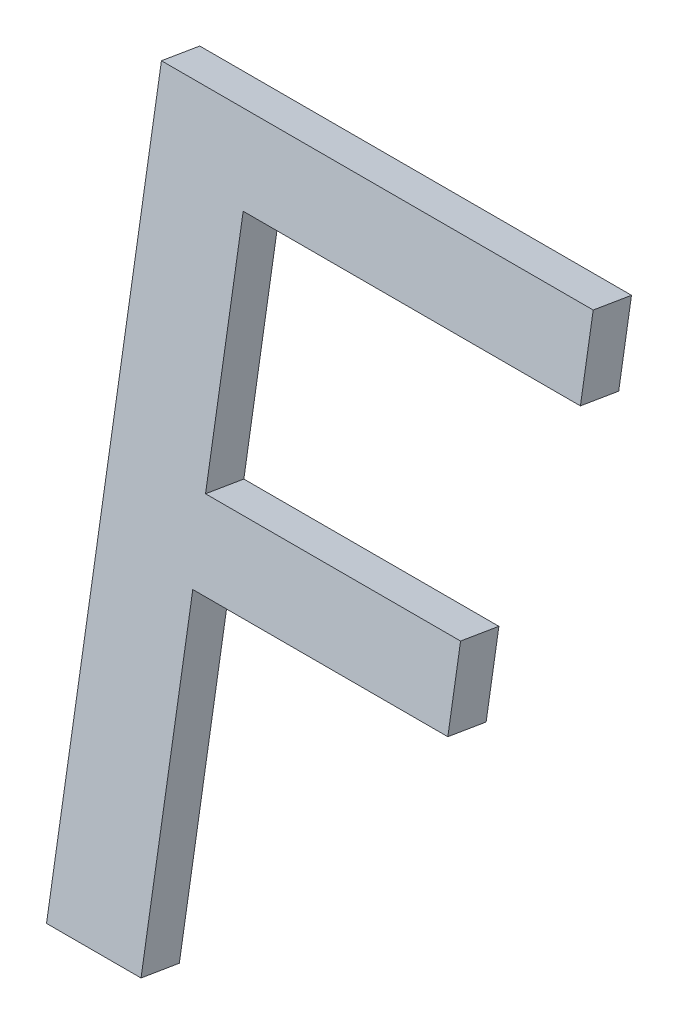
ISO-10303-21;
HEADER;
FILE_DESCRIPTION(('STEP AP214'),'2;1');
FILE_NAME('part.step','',(''),(''),'','','');
FILE_SCHEMA(('AUTOMOTIVE_DESIGN { 1 0 10303 214 1 1 1 1 }'));
ENDSEC;
DATA;
#1=APPLICATION_CONTEXT('core data for automotive mechanical design processes');
#2=APPLICATION_PROTOCOL_DEFINITION('international standard','automotive_design',2000,#1);
#3=PRODUCT_CONTEXT('',#1,'mechanical');
#4=PRODUCT('Part','Part','',(#3));
#5=PRODUCT_RELATED_PRODUCT_CATEGORY('part','',(#4));
#6=PRODUCT_DEFINITION_FORMATION('','',#4);
#7=PRODUCT_DEFINITION_CONTEXT('part definition',#1,'design');
#8=PRODUCT_DEFINITION('design','',#6,#7);
#9=PRODUCT_DEFINITION_SHAPE('','',#8);
#10=(LENGTH_UNIT() NAMED_UNIT(*) SI_UNIT(.MILLI.,.METRE.));
#11=(NAMED_UNIT(*) PLANE_ANGLE_UNIT() SI_UNIT($,.RADIAN.));
#12=(NAMED_UNIT(*) SI_UNIT($,.STERADIAN.) SOLID_ANGLE_UNIT());
#13=UNCERTAINTY_MEASURE_WITH_UNIT(LENGTH_MEASURE(1.E-05),#10,'distance_accuracy_value','');
#14=(GEOMETRIC_REPRESENTATION_CONTEXT(3) GLOBAL_UNCERTAINTY_ASSIGNED_CONTEXT((#13)) GLOBAL_UNIT_ASSIGNED_CONTEXT((#10,
#11,#12)) REPRESENTATION_CONTEXT('',''));
#15=CARTESIAN_POINT('',(0.,0.,0.));
#16=DIRECTION('',(0.,0.,1.));
#17=DIRECTION('',(1.,0.,0.));
#18=AXIS2_PLACEMENT_3D('',#15,#16,#17);
#19=CARTESIAN_POINT('',(1176.66781954887,1267.35947410269,1223.14813558136));
#20=DIRECTION('',(1.,0.,0.));
#21=DIRECTION('',(0.,0.,-1.));
#22=AXIS2_PLACEMENT_3D('',#19,#20,#21);
#23=PLANE('',#22);
#24=CARTESIAN_POINT('',(1176.66781954887,1266.53747916617,1218.2161659622));
#25=CARTESIAN_POINT('',(1176.66781954887,1256.84439088155,1219.83168067631));
#26=CARTESIAN_POINT('',(1176.66781954887,1247.15130259693,1221.44719539041));
#27=CARTESIAN_POINT('',(1176.66781954887,1237.4582143123,1223.06271010451));
#28=B_SPLINE_CURVE_WITH_KNOTS('',3,(#24,#25,#26,#27),.UNSPECIFIED.,.F.,.F.,(4,4),(0.,
0.0826196397014323),.UNSPECIFIED.);
#29=CARTESIAN_POINT('',(1176.66781954887,1266.53747916617,1218.2161659622));
#30=VERTEX_POINT('',#29);
#31=CARTESIAN_POINT('',(1176.66781954887,1237.4582143123,1223.06271010451));
#32=VERTEX_POINT('',#31);
#33=EDGE_CURVE('E105',#30,#32,#28,.T.);
#34=ORIENTED_EDGE('',*,*,#33,.F.);
#35=DIRECTION('',(0.,-0.164398987305355,-0.986393923832144));
#36=VECTOR('',#35,1.);
#37=CARTESIAN_POINT('',(1176.66781954887,1267.35947410269,1223.14813558136));
#38=LINE('',#37,#36);
#39=CARTESIAN_POINT('',(1176.66781954887,1267.35947410269,1223.14813558136));
#40=VERTEX_POINT('',#39);
#41=EDGE_CURVE('E96',#40,#30,#38,.T.);
#42=ORIENTED_EDGE('',*,*,#41,.F.);
#43=CARTESIAN_POINT('',(1176.66781954887,1267.35947410269,1223.14813558136));
#44=CARTESIAN_POINT('',(1176.66781954887,1257.66638581807,1224.76365029547));
#45=CARTESIAN_POINT('',(1176.66781954887,1247.97329753345,1226.37916500957));
#46=CARTESIAN_POINT('',(1176.66781954887,1238.28020924883,1227.99467972367));
#47=B_SPLINE_CURVE_WITH_KNOTS('',3,(#43,#44,#45,#46),.UNSPECIFIED.,.F.,.F.,(4,4),(0.,
0.0826196397014323),.UNSPECIFIED.);
#48=CARTESIAN_POINT('',(1176.66781954887,1238.28020924883,1227.99467972367));
#49=VERTEX_POINT('',#48);
#50=EDGE_CURVE('E104',#40,#49,#47,.T.);
#51=ORIENTED_EDGE('',*,*,#50,.T.);
#52=DIRECTION('',(0.,-0.164398987305355,-0.986393923832144));
#53=VECTOR('',#52,1.);
#54=CARTESIAN_POINT('',(1176.66781954887,1238.28020924883,1227.99467972367));
#55=LINE('',#54,#53);
#56=EDGE_CURVE('E114',#49,#32,#55,.T.);
#57=ORIENTED_EDGE('',*,*,#56,.T.);
#58=EDGE_LOOP('',(#34,#42,#51,#57));
#59=FACE_BOUND('',#58,.T.);
#60=ADVANCED_FACE('F17',(#59),#23,.T.);
#61=CARTESIAN_POINT('',(1176.66781954887,1238.28020924883,1227.99467972367));
#62=DIRECTION('',(0.,0.986393923832144,-0.164398987305355));
#63=DIRECTION('',(0.,0.164398987305355,0.986393923832144));
#64=AXIS2_PLACEMENT_3D('',#61,#62,#63);
#65=PLANE('',#64);
#66=CARTESIAN_POINT('',(1176.66781954887,1237.4582143123,1223.06271010451));
#67=CARTESIAN_POINT('',(1187.61157894737,1237.4582143123,1223.06271010451));
#68=CARTESIAN_POINT('',(1198.55533834586,1237.4582143123,1223.06271010451));
#69=CARTESIAN_POINT('',(1209.49909774436,1237.4582143123,1223.06271010451));
#70=B_SPLINE_CURVE_WITH_KNOTS('',3,(#66,#67,#68,#69),.UNSPECIFIED.,.F.,.F.,(4,4),
(0.0826196397014323,0.174630280043704),.UNSPECIFIED.);
#71=CARTESIAN_POINT('',(1209.49909774436,1237.4582143123,1223.06271010451));
#72=VERTEX_POINT('',#71);
#73=EDGE_CURVE('E132',#32,#72,#70,.T.);
#74=ORIENTED_EDGE('',*,*,#73,.F.);
#75=ORIENTED_EDGE('',*,*,#56,.F.);
#76=CARTESIAN_POINT('',(1176.66781954887,1238.28020924883,1227.99467972367));
#77=CARTESIAN_POINT('',(1187.61157894737,1238.28020924883,1227.99467972367));
#78=CARTESIAN_POINT('',(1198.55533834586,1238.28020924883,1227.99467972367));
#79=CARTESIAN_POINT('',(1209.49909774436,1238.28020924883,1227.99467972367));
#80=B_SPLINE_CURVE_WITH_KNOTS('',3,(#76,#77,#78,#79),.UNSPECIFIED.,.F.,.F.,(4,4),
(0.0826196397014323,0.174630280043704),.UNSPECIFIED.);
#81=CARTESIAN_POINT('',(1209.49909774436,1238.28020924883,1227.99467972367));
#82=VERTEX_POINT('',#81);
#83=EDGE_CURVE('E142',#49,#82,#80,.T.);
#84=ORIENTED_EDGE('',*,*,#83,.T.);
#85=DIRECTION('',(0.,-0.164398987305355,-0.986393923832144));
#86=VECTOR('',#85,1.);
#87=CARTESIAN_POINT('',(1209.49909774436,1238.28020924883,1227.99467972367));
#88=LINE('',#87,#86);
#89=EDGE_CURVE('E153',#82,#72,#88,.T.);
#90=ORIENTED_EDGE('',*,*,#89,.T.);
#91=EDGE_LOOP('',(#74,#75,#84,#90));
#92=FACE_BOUND('',#91,.T.);
#93=ADVANCED_FACE('F424',(#92),#65,.T.);
#94=CARTESIAN_POINT('',(1209.49909774436,1238.28020924883,1227.99467972367));
#95=DIRECTION('',(1.,0.,0.));
#96=DIRECTION('',(0.,0.,-1.));
#97=AXIS2_PLACEMENT_3D('',#94,#95,#96);
#98=PLANE('',#97);
#99=CARTESIAN_POINT('',(1209.49909774436,1237.4582143123,1223.06271010451));
#100=CARTESIAN_POINT('',(1209.49909774436,1234.1752807969,1223.60986569042));
#101=CARTESIAN_POINT('',(1209.49909774436,1230.89234728149,1224.15702127632));
#102=CARTESIAN_POINT('',(1209.49909774436,1227.60941376608,1224.70417686222));
#103=B_SPLINE_CURVE_WITH_KNOTS('',3,(#99,#100,#101,#102),.UNSPECIFIED.,.F.,.F.,(4,4),
(0.174630280043704,0.202612567653425),.UNSPECIFIED.);
#104=CARTESIAN_POINT('',(1209.49909774436,1227.60941376608,1224.70417686222));
#105=VERTEX_POINT('',#104);
#106=EDGE_CURVE('E156',#72,#105,#103,.T.);
#107=ORIENTED_EDGE('',*,*,#106,.F.);
#108=ORIENTED_EDGE('',*,*,#89,.F.);
#109=CARTESIAN_POINT('',(1209.49909774436,1238.28020924883,1227.99467972367));
#110=CARTESIAN_POINT('',(1209.49909774436,1234.99727573342,1228.54183530958));
#111=CARTESIAN_POINT('',(1209.49909774436,1231.71434221802,1229.08899089548));
#112=CARTESIAN_POINT('',(1209.49909774436,1228.43140870261,1229.63614648138));
#113=B_SPLINE_CURVE_WITH_KNOTS('',3,(#109,#110,#111,#112),.UNSPECIFIED.,.F.,.F.,(4,4),
(0.174630280043704,0.202612567653425),.UNSPECIFIED.);
#114=CARTESIAN_POINT('',(1209.49909774436,1228.43140870261,1229.63614648138));
#115=VERTEX_POINT('',#114);
#116=EDGE_CURVE('E167',#82,#115,#113,.T.);
#117=ORIENTED_EDGE('',*,*,#116,.T.);
#118=DIRECTION('',(0.,-0.164398987305355,-0.986393923832144));
#119=VECTOR('',#118,1.);
#120=CARTESIAN_POINT('',(1209.49909774436,1228.43140870261,1229.63614648138));
#121=LINE('',#120,#119);
#122=EDGE_CURVE('E178',#115,#105,#121,.T.);
#123=ORIENTED_EDGE('',*,*,#122,.T.);
#124=EDGE_LOOP('',(#107,#108,#117,#123));
#125=FACE_BOUND('',#124,.T.);
#126=ADVANCED_FACE('F411',(#125),#98,.T.);
#127=CARTESIAN_POINT('',(1209.49909774436,1228.43140870261,1229.63614648138));
#128=DIRECTION('',(0.,-0.986393923832144,0.164398987305355));
#129=DIRECTION('',(0.,-0.164398987305355,-0.986393923832144));
#130=AXIS2_PLACEMENT_3D('',#127,#128,#129);
#131=PLANE('',#130);
#132=CARTESIAN_POINT('',(1209.49909774436,1227.60941376608,1224.70417686222));
#133=CARTESIAN_POINT('',(1198.55533834586,1227.60941376608,1224.70417686222));
#134=CARTESIAN_POINT('',(1187.61157894737,1227.60941376608,1224.70417686222));
#135=CARTESIAN_POINT('',(1176.66781954887,1227.60941376608,1224.70417686222));
#136=B_SPLINE_CURVE_WITH_KNOTS('',3,(#132,#133,#134,#135),.UNSPECIFIED.,.F.,.F.,(4,4),
(0.202612567653425,0.294623207995696),.UNSPECIFIED.);
#137=CARTESIAN_POINT('',(1176.66781954887,1227.60941376608,1224.70417686222));
#138=VERTEX_POINT('',#137);
#139=EDGE_CURVE('E181',#105,#138,#136,.T.);
#140=ORIENTED_EDGE('',*,*,#139,.F.);
#141=ORIENTED_EDGE('',*,*,#122,.F.);
#142=CARTESIAN_POINT('',(1209.49909774436,1228.43140870261,1229.63614648138));
#143=CARTESIAN_POINT('',(1198.55533834586,1228.43140870261,1229.63614648138));
#144=CARTESIAN_POINT('',(1187.61157894737,1228.43140870261,1229.63614648138));
#145=CARTESIAN_POINT('',(1176.66781954887,1228.43140870261,1229.63614648138));
#146=B_SPLINE_CURVE_WITH_KNOTS('',3,(#142,#143,#144,#145),.UNSPECIFIED.,.F.,.F.,(4,4),
(0.202612567653425,0.294623207995696),.UNSPECIFIED.);
#147=CARTESIAN_POINT('',(1176.66781954887,1228.43140870261,1229.63614648138));
#148=VERTEX_POINT('',#147);
#149=EDGE_CURVE('E192',#115,#148,#146,.T.);
#150=ORIENTED_EDGE('',*,*,#149,.T.);
#151=DIRECTION('',(0.,-0.164398987305355,-0.986393923832144));
#152=VECTOR('',#151,1.);
#153=CARTESIAN_POINT('',(1176.66781954887,1228.43140870261,1229.63614648138));
#154=LINE('',#153,#152);
#155=EDGE_CURVE('E203',#148,#138,#154,.T.);
#156=ORIENTED_EDGE('',*,*,#155,.T.);
#157=EDGE_LOOP('',(#140,#141,#150,#156));
#158=FACE_BOUND('',#157,.T.);
#159=ADVANCED_FACE('F405',(#158),#131,.T.);
#160=CARTESIAN_POINT('',(1176.66781954887,1228.43140870261,1229.63614648138));
#161=DIRECTION('',(1.,0.,0.));
#162=DIRECTION('',(0.,1.,0.));
#163=AXIS2_PLACEMENT_3D('',#160,#161,#162);
#164=PLANE('',#163);
#165=CARTESIAN_POINT('',(1176.66781954887,1227.60941376608,1224.70417686222));
#166=CARTESIAN_POINT('',(1176.66781954887,1214.28303937745,1226.92523926032));
#167=CARTESIAN_POINT('',(1176.66781954887,1200.95666498882,1229.14630165843));
#168=CARTESIAN_POINT('',(1176.66781954887,1187.6302906002,1231.36736405653));
#169=B_SPLINE_CURVE_WITH_KNOTS('',3,(#165,#166,#167,#168),.UNSPECIFIED.,.F.,.F.,(4,4),
(0.294623207995696,0.408211387344251),.UNSPECIFIED.);
#170=CARTESIAN_POINT('',(1176.66781954887,1187.6302906002,1231.36736405653));
#171=VERTEX_POINT('',#170);
#172=EDGE_CURVE('E206',#138,#171,#169,.T.);
#173=ORIENTED_EDGE('',*,*,#172,.F.);
#174=ORIENTED_EDGE('',*,*,#155,.F.);
#175=CARTESIAN_POINT('',(1176.66781954887,1228.43140870261,1229.63614648138));
#176=CARTESIAN_POINT('',(1176.66781954887,1215.10503431398,1231.85720887948));
#177=CARTESIAN_POINT('',(1176.66781954887,1201.77865992535,1234.07827127759));
#178=CARTESIAN_POINT('',(1176.66781954887,1188.45228553672,1236.29933367569));
#179=B_SPLINE_CURVE_WITH_KNOTS('',3,(#175,#176,#177,#178),.UNSPECIFIED.,.F.,.F.,(4,4),
(0.294623207995696,0.408211387344251),.UNSPECIFIED.);
#180=CARTESIAN_POINT('',(1176.66781954887,1188.45228553672,1236.29933367569));
#181=VERTEX_POINT('',#180);
#182=EDGE_CURVE('E217',#148,#181,#179,.T.);
#183=ORIENTED_EDGE('',*,*,#182,.T.);
#184=DIRECTION('',(0.,-0.164398987305355,-0.986393923832144));
#185=VECTOR('',#184,1.);
#186=CARTESIAN_POINT('',(1176.66781954887,1188.45228553672,1236.29933367569));
#187=LINE('',#186,#185);
#188=EDGE_CURVE('E228',#181,#171,#187,.T.);
#189=ORIENTED_EDGE('',*,*,#188,.T.);
#190=EDGE_LOOP('',(#173,#174,#183,#189));
#191=FACE_BOUND('',#190,.T.);
#192=ADVANCED_FACE('F410',(#191),#164,.T.);
#193=CARTESIAN_POINT('',(1176.66781954887,1188.45228553672,1236.29933367569));
#194=DIRECTION('',(0.,-0.986393923832144,0.164398987305355));
#195=DIRECTION('',(0.,-0.164398987305355,-0.986393923832144));
#196=AXIS2_PLACEMENT_3D('',#193,#194,#195);
#197=PLANE('',#196);
#198=CARTESIAN_POINT('',(1176.66781954887,1187.6302906002,1231.36736405653));
#199=CARTESIAN_POINT('',(1172.61187969924,1187.6302906002,1231.36736405653));
#200=CARTESIAN_POINT('',(1168.55593984962,1187.6302906002,1231.36736405653));
#201=CARTESIAN_POINT('',(1164.5,1187.6302906002,1231.36736405653));
#202=B_SPLINE_CURVE_WITH_KNOTS('',3,(#198,#199,#200,#201),.UNSPECIFIED.,.F.,.F.,(4,4),
(0.408211387344251,0.442312066020074),.UNSPECIFIED.);
#203=CARTESIAN_POINT('',(1164.5,1187.6302906002,1231.36736405653));
#204=VERTEX_POINT('',#203);
#205=EDGE_CURVE('E231',#171,#204,#202,.T.);
#206=ORIENTED_EDGE('',*,*,#205,.F.);
#207=ORIENTED_EDGE('',*,*,#188,.F.);
#208=CARTESIAN_POINT('',(1176.66781954887,1188.45228553672,1236.29933367569));
#209=CARTESIAN_POINT('',(1172.61187969924,1188.45228553672,1236.29933367569));
#210=CARTESIAN_POINT('',(1168.55593984962,1188.45228553672,1236.29933367569));
#211=CARTESIAN_POINT('',(1164.5,1188.45228553672,1236.29933367569));
#212=B_SPLINE_CURVE_WITH_KNOTS('',3,(#208,#209,#210,#211),.UNSPECIFIED.,.F.,.F.,(4,4),
(0.408211387344251,0.442312066020074),.UNSPECIFIED.);
#213=CARTESIAN_POINT('',(1164.5,1188.45228553672,1236.29933367569));
#214=VERTEX_POINT('',#213);
#215=EDGE_CURVE('E242',#181,#214,#212,.T.);
#216=ORIENTED_EDGE('',*,*,#215,.T.);
#217=DIRECTION('',(0.,-0.164398987305355,-0.986393923832144));
#218=VECTOR('',#217,1.);
#219=CARTESIAN_POINT('',(1164.5,1188.45228553672,1236.29933367569));
#220=LINE('',#219,#218);
#221=EDGE_CURVE('E253',#214,#204,#220,.T.);
#222=ORIENTED_EDGE('',*,*,#221,.T.);
#223=EDGE_LOOP('',(#206,#207,#216,#222));
#224=FACE_BOUND('',#223,.T.);
#225=ADVANCED_FACE('F396',(#224),#197,.T.);
#226=CARTESIAN_POINT('',(1164.5,1188.45228553672,1236.29933367569));
#227=DIRECTION('',(-1.,0.,0.));
#228=DIRECTION('',(0.,-1.,0.));
#229=AXIS2_PLACEMENT_3D('',#226,#227,#228);
#230=PLANE('',#229);
#231=CARTESIAN_POINT('',(1164.5,1187.6302906002,1231.36736405653));
#232=CARTESIAN_POINT('',(1164.5,1217.22210831516,1226.43539443737));
#233=CARTESIAN_POINT('',(1164.5,1246.81392603012,1221.50342481821));
#234=CARTESIAN_POINT('',(1164.5,1276.40574374509,1216.57145519905));
#235=B_SPLINE_CURVE_WITH_KNOTS('',3,(#231,#232,#233,#234),.UNSPECIFIED.,.F.,.F.,(4,4),
(0.442312066020074,0.694539761253161),.UNSPECIFIED.);
#236=CARTESIAN_POINT('',(1164.5,1276.40574374509,1216.57145519905));
#237=VERTEX_POINT('',#236);
#238=EDGE_CURVE('E256',#204,#237,#235,.T.);
#239=ORIENTED_EDGE('',*,*,#238,.F.);
#240=ORIENTED_EDGE('',*,*,#221,.F.);
#241=CARTESIAN_POINT('',(1164.5,1188.45228553672,1236.29933367569));
#242=CARTESIAN_POINT('',(1164.5,1218.04410325169,1231.36736405653));
#243=CARTESIAN_POINT('',(1164.5,1247.63592096665,1226.43539443737));
#244=CARTESIAN_POINT('',(1164.5,1277.22773868162,1221.50342481821));
#245=B_SPLINE_CURVE_WITH_KNOTS('',3,(#241,#242,#243,#244),.UNSPECIFIED.,.F.,.F.,(4,4),
(0.442312066020074,0.694539761253161),.UNSPECIFIED.);
#246=CARTESIAN_POINT('',(1164.5,1277.22773868162,1221.50342481821));
#247=VERTEX_POINT('',#246);
#248=EDGE_CURVE('E267',#214,#247,#245,.T.);
#249=ORIENTED_EDGE('',*,*,#248,.T.);
#250=DIRECTION('',(0.,-0.164398987305355,-0.986393923832144));
#251=VECTOR('',#250,1.);
#252=CARTESIAN_POINT('',(1164.5,1277.22773868162,1221.50342481821));
#253=LINE('',#252,#251);
#254=EDGE_CURVE('E278',#247,#237,#253,.T.);
#255=ORIENTED_EDGE('',*,*,#254,.T.);
#256=EDGE_LOOP('',(#239,#240,#249,#255));
#257=FACE_BOUND('',#256,.T.);
#258=ADVANCED_FACE('F384',(#257),#230,.T.);
#259=CARTESIAN_POINT('',(1164.5,1277.22773868162,1221.50342481821));
#260=DIRECTION('',(0.,0.986393923832144,-0.164398987305355));
#261=DIRECTION('',(0.,0.164398987305355,0.986393923832144));
#262=AXIS2_PLACEMENT_3D('',#259,#260,#261);
#263=PLANE('',#262);
#264=CARTESIAN_POINT('',(1164.5,1276.40574374509,1216.57145519905));
#265=CARTESIAN_POINT('',(1183.02631578947,1276.40574374509,1216.57145519905));
#266=CARTESIAN_POINT('',(1201.55263157894,1276.40574374509,1216.57145519905));
#267=CARTESIAN_POINT('',(1220.07894736842,1276.40574374509,1216.57145519905));
#268=B_SPLINE_CURVE_WITH_KNOTS('',3,(#264,#265,#266,#267),.UNSPECIFIED.,.F.,.F.,(4,4),
(0.694539761253161,0.850301425677803),.UNSPECIFIED.);
#269=CARTESIAN_POINT('',(1220.07894736842,1276.40574374509,1216.57145519905));
#270=VERTEX_POINT('',#269);
#271=EDGE_CURVE('E281',#237,#270,#268,.T.);
#272=ORIENTED_EDGE('',*,*,#271,.F.);
#273=ORIENTED_EDGE('',*,*,#254,.F.);
#274=CARTESIAN_POINT('',(1164.5,1277.22773868162,1221.50342481821));
#275=CARTESIAN_POINT('',(1183.02631578947,1277.22773868162,1221.50342481821));
#276=CARTESIAN_POINT('',(1201.55263157894,1277.22773868162,1221.50342481821));
#277=CARTESIAN_POINT('',(1220.07894736842,1277.22773868162,1221.50342481821));
#278=B_SPLINE_CURVE_WITH_KNOTS('',3,(#274,#275,#276,#277),.UNSPECIFIED.,.F.,.F.,(4,4),
(0.694539761253161,0.850301425677803),.UNSPECIFIED.);
#279=CARTESIAN_POINT('',(1220.07894736842,1277.22773868162,1221.50342481821));
#280=VERTEX_POINT('',#279);
#281=EDGE_CURVE('E291',#247,#280,#278,.T.);
#282=ORIENTED_EDGE('',*,*,#281,.T.);
#283=DIRECTION('',(0.,-0.164398987305355,-0.986393923832144));
#284=VECTOR('',#283,1.);
#285=CARTESIAN_POINT('',(1220.07894736842,1277.22773868162,1221.50342481821));
#286=LINE('',#285,#284);
#287=EDGE_CURVE('E302',#280,#270,#286,.T.);
#288=ORIENTED_EDGE('',*,*,#287,.T.);
#289=EDGE_LOOP('',(#272,#273,#282,#288));
#290=FACE_BOUND('',#289,.T.);
#291=ADVANCED_FACE('F379',(#290),#263,.T.);
#292=CARTESIAN_POINT('',(1220.07894736842,1277.22773868162,1221.50342481821));
#293=DIRECTION('',(1.,0.,0.));
#294=DIRECTION('',(0.,0.,-1.));
#295=AXIS2_PLACEMENT_3D('',#292,#293,#294);
#296=PLANE('',#295);
#297=CARTESIAN_POINT('',(1220.07894736842,1276.40574374509,1216.57145519905));
#298=CARTESIAN_POINT('',(1220.07894736842,1273.11632221878,1217.1196921201));
#299=CARTESIAN_POINT('',(1220.07894736842,1269.82690069247,1217.66792904115));
#300=CARTESIAN_POINT('',(1220.07894736842,1266.53747916617,1218.2161659622));
#301=B_SPLINE_CURVE_WITH_KNOTS('',3,(#297,#298,#299,#300),.UNSPECIFIED.,.F.,.F.,(4,4),
(0.850301425677803,0.878339014251181),.UNSPECIFIED.);
#302=CARTESIAN_POINT('',(1220.07894736842,1266.53747916617,1218.2161659622));
#303=VERTEX_POINT('',#302);
#304=EDGE_CURVE('E111',#270,#303,#301,.T.);
#305=ORIENTED_EDGE('',*,*,#304,.F.);
#306=ORIENTED_EDGE('',*,*,#287,.F.);
#307=CARTESIAN_POINT('',(1220.07894736842,1277.22773868162,1221.50342481821));
#308=CARTESIAN_POINT('',(1220.07894736842,1273.93831715531,1222.05166173926));
#309=CARTESIAN_POINT('',(1220.07894736842,1270.648895629,1222.59989866031));
#310=CARTESIAN_POINT('',(1220.07894736842,1267.35947410269,1223.14813558136));
#311=B_SPLINE_CURVE_WITH_KNOTS('',3,(#307,#308,#309,#310),.UNSPECIFIED.,.F.,.F.,(4,4),
(0.850301425677803,0.878339014251181),.UNSPECIFIED.);
#312=CARTESIAN_POINT('',(1220.07894736842,1267.35947410269,1223.14813558136));
#313=VERTEX_POINT('',#312);
#314=EDGE_CURVE('E314',#280,#313,#311,.T.);
#315=ORIENTED_EDGE('',*,*,#314,.T.);
#316=DIRECTION('',(0.,-0.164398987305355,-0.986393923832144));
#317=VECTOR('',#316,1.);
#318=CARTESIAN_POINT('',(1220.07894736842,1267.35947410269,1223.14813558136));
#319=LINE('',#318,#317);
#320=EDGE_CURVE('E39',#313,#303,#319,.T.);
#321=ORIENTED_EDGE('',*,*,#320,.T.);
#322=EDGE_LOOP('',(#305,#306,#315,#321));
#323=FACE_BOUND('',#322,.T.);
#324=ADVANCED_FACE('F348',(#323),#296,.T.);
#325=CARTESIAN_POINT('',(1220.07894736842,1267.35947410269,1223.14813558136));
#326=DIRECTION('',(0.,-0.986393923832144,0.164398987305355));
#327=DIRECTION('',(0.,-0.164398987305355,-0.986393923832144));
#328=AXIS2_PLACEMENT_3D('',#325,#326,#327);
#329=PLANE('',#328);
#330=CARTESIAN_POINT('',(1220.07894736842,1266.53747916617,1218.2161659622));
#331=CARTESIAN_POINT('',(1205.60857142857,1266.53747916617,1218.2161659622));
#332=CARTESIAN_POINT('',(1191.13819548872,1266.53747916617,1218.2161659622));
#333=CARTESIAN_POINT('',(1176.66781954887,1266.53747916617,1218.2161659622));
#334=B_SPLINE_CURVE_WITH_KNOTS('',3,(#330,#331,#332,#333),.UNSPECIFIED.,.F.,.F.,(4,4),
(0.878339014251181,1.),.UNSPECIFIED.);
#335=EDGE_CURVE('E30',#303,#30,#334,.T.);
#336=ORIENTED_EDGE('',*,*,#335,.F.);
#337=ORIENTED_EDGE('',*,*,#320,.F.);
#338=CARTESIAN_POINT('',(1220.07894736842,1267.35947410269,1223.14813558136));
#339=CARTESIAN_POINT('',(1205.60857142857,1267.35947410269,1223.14813558136));
#340=CARTESIAN_POINT('',(1191.13819548872,1267.35947410269,1223.14813558136));
#341=CARTESIAN_POINT('',(1176.66781954887,1267.35947410269,1223.14813558136));
#342=B_SPLINE_CURVE_WITH_KNOTS('',3,(#338,#339,#340,#341),.UNSPECIFIED.,.F.,.F.,(4,4),
(0.878339014251181,1.),.UNSPECIFIED.);
#343=EDGE_CURVE('E11',#313,#40,#342,.T.);
#344=ORIENTED_EDGE('',*,*,#343,.T.);
#345=ORIENTED_EDGE('',*,*,#41,.T.);
#346=EDGE_LOOP('',(#336,#337,#344,#345));
#347=FACE_BOUND('',#346,.T.);
#348=ADVANCED_FACE('F99',(#347),#329,.T.);
#349=CARTESIAN_POINT('',(1176.66781954887,1252.81984167576,1225.57140765252));
#350=DIRECTION('',(0.,-0.164398987305353,-0.986393923832144));
#351=DIRECTION('',(0.,0.986393923832144,-0.164398987305353));
#352=AXIS2_PLACEMENT_3D('',#349,#350,#351);
#353=PLANE('',#352);
#354=ORIENTED_EDGE('',*,*,#50,.F.);
#355=ORIENTED_EDGE('',*,*,#343,.F.);
#356=ORIENTED_EDGE('',*,*,#314,.F.);
#357=ORIENTED_EDGE('',*,*,#281,.F.);
#358=ORIENTED_EDGE('',*,*,#248,.F.);
#359=ORIENTED_EDGE('',*,*,#215,.F.);
#360=ORIENTED_EDGE('',*,*,#182,.F.);
#361=ORIENTED_EDGE('',*,*,#149,.F.);
#362=ORIENTED_EDGE('',*,*,#116,.F.);
#363=ORIENTED_EDGE('',*,*,#83,.F.);
#364=EDGE_LOOP('',(#354,#355,#356,#357,#358,#359,#360,#361,#362,#363));
#365=FACE_BOUND('',#364,.T.);
#366=ADVANCED_FACE('F347',(#365),#353,.F.);
#367=CARTESIAN_POINT('',(1176.66781954887,1251.99784673924,1220.63943803336));
#368=DIRECTION('',(0.,-0.164398987305353,-0.986393923832144));
#369=DIRECTION('',(0.,0.986393923832144,-0.164398987305353));
#370=AXIS2_PLACEMENT_3D('',#367,#368,#369);
#371=PLANE('',#370);
#372=ORIENTED_EDGE('',*,*,#33,.T.);
#373=ORIENTED_EDGE('',*,*,#73,.T.);
#374=ORIENTED_EDGE('',*,*,#106,.T.);
#375=ORIENTED_EDGE('',*,*,#139,.T.);
#376=ORIENTED_EDGE('',*,*,#172,.T.);
#377=ORIENTED_EDGE('',*,*,#205,.T.);
#378=ORIENTED_EDGE('',*,*,#238,.T.);
#379=ORIENTED_EDGE('',*,*,#271,.T.);
#380=ORIENTED_EDGE('',*,*,#304,.T.);
#381=ORIENTED_EDGE('',*,*,#335,.T.);
#382=EDGE_LOOP('',(#372,#373,#374,#375,#376,#377,#378,#379,#380,#381));
#383=FACE_BOUND('',#382,.T.);
#384=ADVANCED_FACE('F19',(#383),#371,.T.);
#385=CLOSED_SHELL('',(#60,#93,#126,#159,#192,#225,#258,#291,#324,#348,#366,#384));
#386=MANIFOLD_SOLID_BREP('B1',#385);
#387=ADVANCED_BREP_SHAPE_REPRESENTATION('',(#18,#386),#14);
#388=SHAPE_DEFINITION_REPRESENTATION(#9,#387);
ENDSEC;
END-ISO-10303-21;
